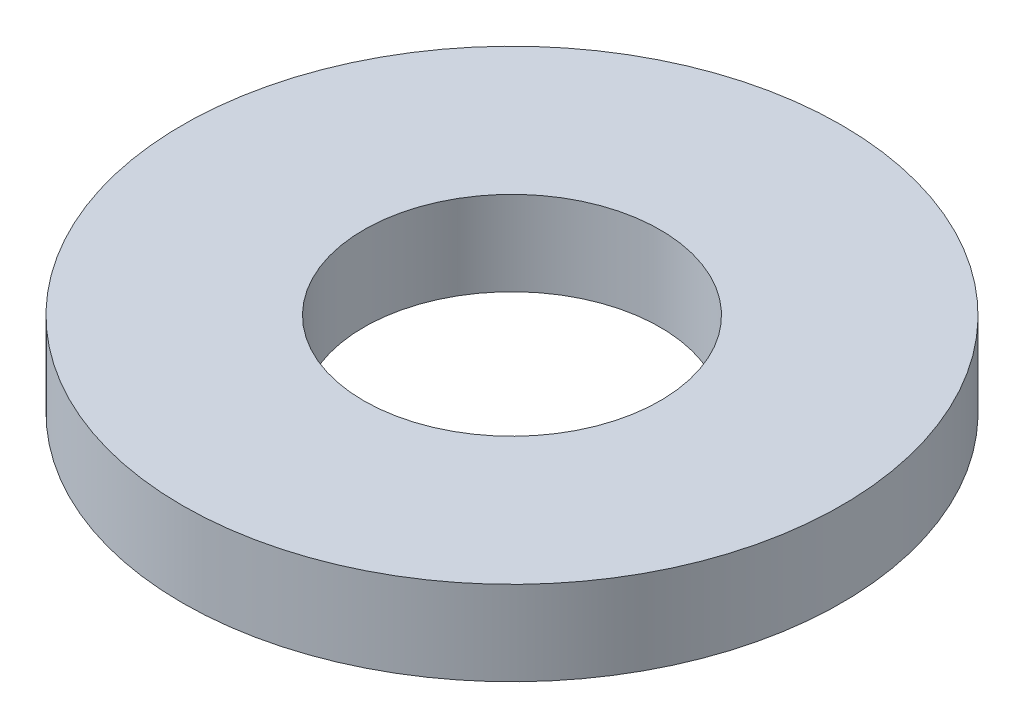
ISO-10303-21;
HEADER;
FILE_DESCRIPTION(('STEP AP214'),'2;1');
FILE_NAME('part.step','',(''),(''),'','','');
FILE_SCHEMA(('AUTOMOTIVE_DESIGN { 1 0 10303 214 1 1 1 1 }'));
ENDSEC;
DATA;
#1=APPLICATION_CONTEXT('core data for automotive mechanical design processes');
#2=APPLICATION_PROTOCOL_DEFINITION('international standard','automotive_design',2000,#1);
#3=PRODUCT_CONTEXT('',#1,'mechanical');
#4=PRODUCT('Part','Part','',(#3));
#5=PRODUCT_RELATED_PRODUCT_CATEGORY('part','',(#4));
#6=PRODUCT_DEFINITION_FORMATION('','',#4);
#7=PRODUCT_DEFINITION_CONTEXT('part definition',#1,'design');
#8=PRODUCT_DEFINITION('design','',#6,#7);
#9=PRODUCT_DEFINITION_SHAPE('','',#8);
#10=(LENGTH_UNIT() NAMED_UNIT(*) SI_UNIT(.MILLI.,.METRE.));
#11=(NAMED_UNIT(*) PLANE_ANGLE_UNIT() SI_UNIT($,.RADIAN.));
#12=(NAMED_UNIT(*) SI_UNIT($,.STERADIAN.) SOLID_ANGLE_UNIT());
#13=UNCERTAINTY_MEASURE_WITH_UNIT(LENGTH_MEASURE(1.E-05),#10,'distance_accuracy_value','');
#14=(GEOMETRIC_REPRESENTATION_CONTEXT(3) GLOBAL_UNCERTAINTY_ASSIGNED_CONTEXT((#13)) GLOBAL_UNIT_ASSIGNED_CONTEXT((#10,
#11,#12)) REPRESENTATION_CONTEXT('',''));
#15=CARTESIAN_POINT('',(0.,0.,0.));
#16=DIRECTION('',(0.,0.,1.));
#17=DIRECTION('',(1.,0.,0.));
#18=AXIS2_PLACEMENT_3D('',#15,#16,#17);
#19=CARTESIAN_POINT('',(0.,19.4355647984472,0.));
#20=DIRECTION('',(0.,1.,0.));
#21=DIRECTION('',(0.,0.,1.));
#22=AXIS2_PLACEMENT_3D('',#19,#20,#21);
#23=CYLINDRICAL_SURFACE('',#22,3.5687);
#24=CARTESIAN_POINT('',(0.,-1.016,0.));
#25=DIRECTION('',(0.,1.,0.));
#26=DIRECTION('',(0.,0.,1.));
#27=AXIS2_PLACEMENT_3D('',#24,#25,#26);
#28=CIRCLE('',#27,3.5687);
#29=CARTESIAN_POINT('',(0.,-1.016,3.5687));
#30=VERTEX_POINT('',#29);
#31=EDGE_CURVE('E10',#30,#30,#28,.T.);
#32=ORIENTED_EDGE('',*,*,#31,.F.);
#33=EDGE_LOOP('',(#32));
#34=FACE_BOUND('',#33,.T.);
#35=CARTESIAN_POINT('',(0.,1.016,0.));
#36=DIRECTION('',(0.,1.,0.));
#37=DIRECTION('',(0.,0.,1.));
#38=AXIS2_PLACEMENT_3D('',#35,#36,#37);
#39=CIRCLE('',#38,3.5687);
#40=CARTESIAN_POINT('',(0.,1.016,3.5687));
#41=VERTEX_POINT('',#40);
#42=EDGE_CURVE('E46',#41,#41,#39,.T.);
#43=ORIENTED_EDGE('',*,*,#42,.T.);
#44=EDGE_LOOP('',(#43));
#45=FACE_BOUND('',#44,.T.);
#46=ADVANCED_FACE('F32',(#34,#45),#23,.F.);
#47=CARTESIAN_POINT('',(0.,-1.016,-3.5687));
#48=DIRECTION('',(0.,1.,0.));
#49=DIRECTION('',(0.,0.,1.));
#50=AXIS2_PLACEMENT_3D('',#47,#48,#49);
#51=PLANE('',#50);
#52=CARTESIAN_POINT('',(0.,-1.016,0.));
#53=DIRECTION('',(0.,1.,0.));
#54=DIRECTION('',(0.,0.,1.));
#55=AXIS2_PLACEMENT_3D('',#52,#53,#54);
#56=CIRCLE('',#55,7.9375);
#57=CARTESIAN_POINT('',(0.,-1.016,7.9375));
#58=VERTEX_POINT('',#57);
#59=EDGE_CURVE('E38',#58,#58,#56,.T.);
#60=ORIENTED_EDGE('',*,*,#59,.F.);
#61=EDGE_LOOP('',(#60));
#62=FACE_BOUND('',#61,.T.);
#63=ORIENTED_EDGE('',*,*,#31,.T.);
#64=EDGE_LOOP('',(#63));
#65=FACE_BOUND('',#64,.T.);
#66=ADVANCED_FACE('F61',(#62,#65),#51,.F.);
#67=CARTESIAN_POINT('',(0.,19.4355647984472,0.));
#68=DIRECTION('',(0.,1.,0.));
#69=DIRECTION('',(0.,0.,1.));
#70=AXIS2_PLACEMENT_3D('',#67,#68,#69);
#71=CYLINDRICAL_SURFACE('',#70,7.9375);
#72=CARTESIAN_POINT('',(0.,1.016,0.));
#73=DIRECTION('',(0.,1.,0.));
#74=DIRECTION('',(0.,0.,1.));
#75=AXIS2_PLACEMENT_3D('',#72,#73,#74);
#76=CIRCLE('',#75,7.9375);
#77=CARTESIAN_POINT('',(0.,1.016,7.9375));
#78=VERTEX_POINT('',#77);
#79=EDGE_CURVE('E42',#78,#78,#76,.T.);
#80=ORIENTED_EDGE('',*,*,#79,.F.);
#81=EDGE_LOOP('',(#80));
#82=FACE_BOUND('',#81,.T.);
#83=ORIENTED_EDGE('',*,*,#59,.T.);
#84=EDGE_LOOP('',(#83));
#85=FACE_BOUND('',#84,.T.);
#86=ADVANCED_FACE('F56',(#82,#85),#71,.T.);
#87=CARTESIAN_POINT('',(0.,1.016,-3.5687));
#88=DIRECTION('',(0.,-1.,0.));
#89=DIRECTION('',(0.,0.,-1.));
#90=AXIS2_PLACEMENT_3D('',#87,#88,#89);
#91=PLANE('',#90);
#92=ORIENTED_EDGE('',*,*,#42,.F.);
#93=EDGE_LOOP('',(#92));
#94=FACE_BOUND('',#93,.T.);
#95=ORIENTED_EDGE('',*,*,#79,.T.);
#96=EDGE_LOOP('',(#95));
#97=FACE_BOUND('',#96,.T.);
#98=ADVANCED_FACE('F53',(#94,#97),#91,.F.);
#99=CLOSED_SHELL('',(#46,#66,#86,#98));
#100=MANIFOLD_SOLID_BREP('B2',#99);
#101=ADVANCED_BREP_SHAPE_REPRESENTATION('',(#18,#100),#14);
#102=SHAPE_DEFINITION_REPRESENTATION(#9,#101);
ENDSEC;
END-ISO-10303-21;
